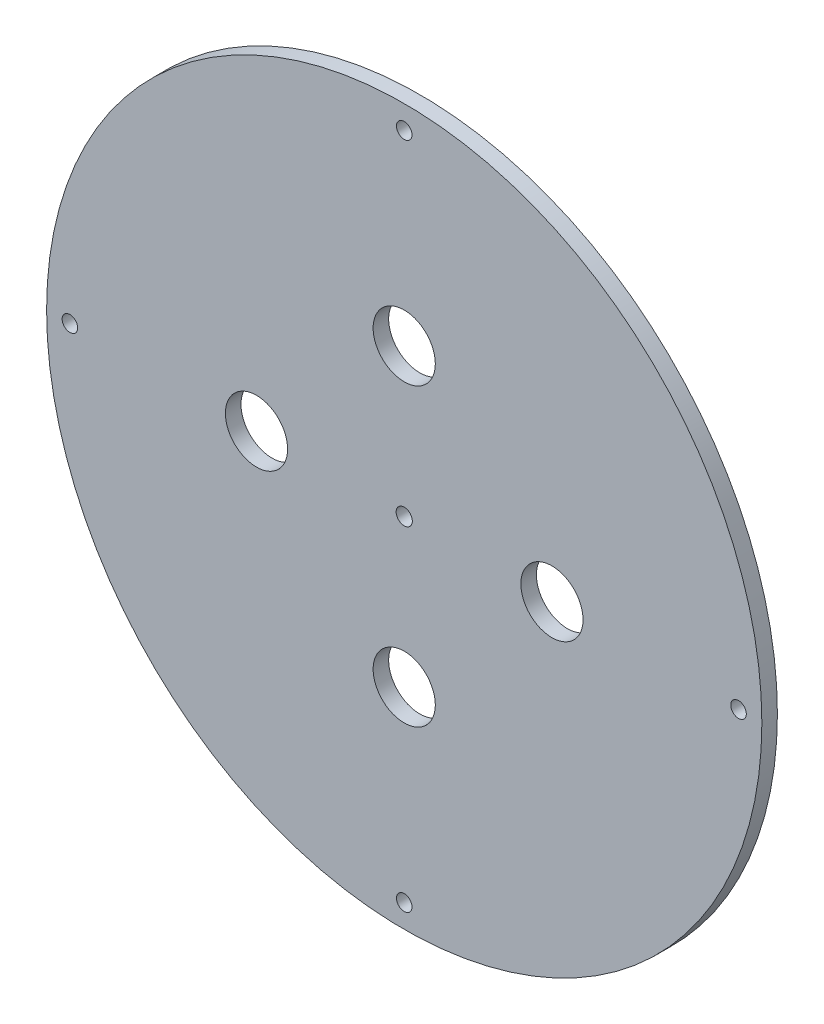
ISO-10303-21;
HEADER;
FILE_DESCRIPTION(('STEP AP214'),'2;1');
FILE_NAME('part.step','',(''),(''),'','','');
FILE_SCHEMA(('AUTOMOTIVE_DESIGN { 1 0 10303 214 1 1 1 1 }'));
ENDSEC;
DATA;
#1=APPLICATION_CONTEXT('core data for automotive mechanical design processes');
#2=APPLICATION_PROTOCOL_DEFINITION('international standard','automotive_design',2000,#1);
#3=PRODUCT_CONTEXT('',#1,'mechanical');
#4=PRODUCT('Part','Part','',(#3));
#5=PRODUCT_RELATED_PRODUCT_CATEGORY('part','',(#4));
#6=PRODUCT_DEFINITION_FORMATION('','',#4);
#7=PRODUCT_DEFINITION_CONTEXT('part definition',#1,'design');
#8=PRODUCT_DEFINITION('design','',#6,#7);
#9=PRODUCT_DEFINITION_SHAPE('','',#8);
#10=(LENGTH_UNIT() NAMED_UNIT(*) SI_UNIT(.MILLI.,.METRE.));
#11=(NAMED_UNIT(*) PLANE_ANGLE_UNIT() SI_UNIT($,.RADIAN.));
#12=(NAMED_UNIT(*) SI_UNIT($,.STERADIAN.) SOLID_ANGLE_UNIT());
#13=UNCERTAINTY_MEASURE_WITH_UNIT(LENGTH_MEASURE(1.E-05),#10,'distance_accuracy_value','');
#14=(GEOMETRIC_REPRESENTATION_CONTEXT(3) GLOBAL_UNCERTAINTY_ASSIGNED_CONTEXT((#13)) GLOBAL_UNIT_ASSIGNED_CONTEXT((#10,
#11,#12)) REPRESENTATION_CONTEXT('',''));
#15=CARTESIAN_POINT('',(0.,0.,0.));
#16=DIRECTION('',(0.,0.,1.));
#17=DIRECTION('',(1.,0.,0.));
#18=AXIS2_PLACEMENT_3D('',#15,#16,#17);
#19=CARTESIAN_POINT('',(0.,0.,6.35));
#20=DIRECTION('',(0.,0.,1.));
#21=DIRECTION('',(1.,0.,0.));
#22=AXIS2_PLACEMENT_3D('',#19,#20,#21);
#23=PLANE('',#22);
#24=CARTESIAN_POINT('',(3.41430387914653E-12,-60.325,6.35));
#25=DIRECTION('',(0.,0.,1.));
#26=DIRECTION('',(1.,0.,0.));
#27=AXIS2_PLACEMENT_3D('',#24,#25,#26);
#28=CIRCLE('',#27,12.7000000000037);
#29=CARTESIAN_POINT('',(12.7000000000071,-60.325,6.35));
#30=VERTEX_POINT('',#29);
#31=EDGE_CURVE('E90',#30,#30,#28,.T.);
#32=ORIENTED_EDGE('',*,*,#31,.F.);
#33=EDGE_LOOP('',(#32));
#34=FACE_BOUND('',#33,.T.);
#35=CARTESIAN_POINT('',(0.,0.,6.35));
#36=DIRECTION('',(0.,0.,1.));
#37=DIRECTION('',(1.,0.,0.));
#38=AXIS2_PLACEMENT_3D('',#35,#36,#37);
#39=CIRCLE('',#38,3.302);
#40=CARTESIAN_POINT('',(3.302,0.,6.35));
#41=VERTEX_POINT('',#40);
#42=EDGE_CURVE('E76',#41,#41,#39,.T.);
#43=ORIENTED_EDGE('',*,*,#42,.F.);
#44=EDGE_LOOP('',(#43));
#45=FACE_BOUND('',#44,.T.);
#46=CARTESIAN_POINT('',(2.4651822361902E-12,-136.525,6.35));
#47=DIRECTION('',(0.,0.,1.));
#48=DIRECTION('',(1.,0.,0.));
#49=AXIS2_PLACEMENT_3D('',#46,#47,#48);
#50=CIRCLE('',#49,3.175);
#51=CARTESIAN_POINT('',(3.17500000000246,-136.525,6.35));
#52=VERTEX_POINT('',#51);
#53=EDGE_CURVE('E62',#52,#52,#50,.T.);
#54=ORIENTED_EDGE('',*,*,#53,.F.);
#55=EDGE_LOOP('',(#54));
#56=FACE_BOUND('',#55,.T.);
#57=CARTESIAN_POINT('',(0.,60.325,6.35));
#58=DIRECTION('',(0.,0.,1.));
#59=DIRECTION('',(1.,0.,0.));
#60=AXIS2_PLACEMENT_3D('',#57,#58,#59);
#61=CIRCLE('',#60,12.7);
#62=CARTESIAN_POINT('',(12.7,60.325,6.35));
#63=VERTEX_POINT('',#62);
#64=EDGE_CURVE('E52',#63,#63,#61,.T.);
#65=ORIENTED_EDGE('',*,*,#64,.F.);
#66=EDGE_LOOP('',(#65));
#67=FACE_BOUND('',#66,.T.);
#68=CARTESIAN_POINT('',(0.,0.,6.35));
#69=DIRECTION('',(0.,0.,1.));
#70=DIRECTION('',(1.,0.,0.));
#71=AXIS2_PLACEMENT_3D('',#68,#69,#70);
#72=CIRCLE('',#71,146.05);
#73=CARTESIAN_POINT('',(146.05,0.,6.35));
#74=VERTEX_POINT('',#73);
#75=EDGE_CURVE('E10',#74,#74,#72,.T.);
#76=ORIENTED_EDGE('',*,*,#75,.T.);
#77=EDGE_LOOP('',(#76));
#78=FACE_BOUND('',#77,.T.);
#79=CARTESIAN_POINT('',(0.,136.525,6.35));
#80=DIRECTION('',(0.,0.,1.));
#81=DIRECTION('',(1.,0.,0.));
#82=AXIS2_PLACEMENT_3D('',#79,#80,#81);
#83=CIRCLE('',#82,3.175);
#84=CARTESIAN_POINT('',(3.175,136.525,6.35));
#85=VERTEX_POINT('',#84);
#86=EDGE_CURVE('E48',#85,#85,#83,.T.);
#87=ORIENTED_EDGE('',*,*,#86,.F.);
#88=EDGE_LOOP('',(#87));
#89=FACE_BOUND('',#88,.T.);
#90=CARTESIAN_POINT('',(136.525000000001,1.2325911180951E-12,6.35));
#91=DIRECTION('',(0.,0.,1.));
#92=DIRECTION('',(1.,0.,0.));
#93=AXIS2_PLACEMENT_3D('',#90,#91,#92);
#94=CIRCLE('',#93,3.175);
#95=CARTESIAN_POINT('',(139.700000000001,1.2325911180951E-12,6.35));
#96=VERTEX_POINT('',#95);
#97=EDGE_CURVE('E56',#96,#96,#94,.T.);
#98=ORIENTED_EDGE('',*,*,#97,.F.);
#99=EDGE_LOOP('',(#98));
#100=FACE_BOUND('',#99,.T.);
#101=CARTESIAN_POINT('',(-136.524999999999,-1.24931060852046E-12,6.35));
#102=DIRECTION('',(0.,0.,1.));
#103=DIRECTION('',(1.,0.,0.));
#104=AXIS2_PLACEMENT_3D('',#101,#102,#103);
#105=CIRCLE('',#104,3.175);
#106=CARTESIAN_POINT('',(-133.349999999999,-1.24931060852046E-12,6.35));
#107=VERTEX_POINT('',#106);
#108=EDGE_CURVE('E72',#107,#107,#105,.T.);
#109=ORIENTED_EDGE('',*,*,#108,.F.);
#110=EDGE_LOOP('',(#109));
#111=FACE_BOUND('',#110,.T.);
#112=CARTESIAN_POINT('',(60.3250000000017,1.70715193957327E-12,6.35));
#113=DIRECTION('',(0.,0.,1.));
#114=DIRECTION('',(1.,0.,0.));
#115=AXIS2_PLACEMENT_3D('',#112,#113,#114);
#116=CIRCLE('',#115,12.7000000000013);
#117=CARTESIAN_POINT('',(73.025000000003,1.70715193957327E-12,6.35));
#118=VERTEX_POINT('',#117);
#119=EDGE_CURVE('E83',#118,#118,#116,.T.);
#120=ORIENTED_EDGE('',*,*,#119,.F.);
#121=EDGE_LOOP('',(#120));
#122=FACE_BOUND('',#121,.T.);
#123=CARTESIAN_POINT('',(-60.3249999999983,-1.71453962138912E-12,6.35));
#124=DIRECTION('',(0.,0.,1.));
#125=DIRECTION('',(1.,0.,0.));
#126=AXIS2_PLACEMENT_3D('',#123,#124,#125);
#127=CIRCLE('',#126,12.7000000000027);
#128=CARTESIAN_POINT('',(-47.6249999999956,-1.71453962138912E-12,6.35));
#129=VERTEX_POINT('',#128);
#130=EDGE_CURVE('E92',#129,#129,#127,.T.);
#131=ORIENTED_EDGE('',*,*,#130,.F.);
#132=EDGE_LOOP('',(#131));
#133=FACE_BOUND('',#132,.T.);
#134=ADVANCED_FACE('F40',(#34,#45,#56,#67,#78,#89,#100,#111,#122,#133),#23,.T.);
#135=CARTESIAN_POINT('',(0.,0.,0.));
#136=DIRECTION('',(0.,0.,1.));
#137=DIRECTION('',(1.,0.,0.));
#138=AXIS2_PLACEMENT_3D('',#135,#136,#137);
#139=PLANE('',#138);
#140=CARTESIAN_POINT('',(0.,0.,0.));
#141=DIRECTION('',(0.,0.,1.));
#142=DIRECTION('',(1.,0.,0.));
#143=AXIS2_PLACEMENT_3D('',#140,#141,#142);
#144=CIRCLE('',#143,146.05);
#145=CARTESIAN_POINT('',(146.05,0.,0.));
#146=VERTEX_POINT('',#145);
#147=EDGE_CURVE('E41',#146,#146,#144,.T.);
#148=ORIENTED_EDGE('',*,*,#147,.F.);
#149=EDGE_LOOP('',(#148));
#150=FACE_BOUND('',#149,.T.);
#151=CARTESIAN_POINT('',(0.,136.525,0.));
#152=DIRECTION('',(0.,0.,1.));
#153=DIRECTION('',(1.,0.,0.));
#154=AXIS2_PLACEMENT_3D('',#151,#152,#153);
#155=CIRCLE('',#154,3.175);
#156=CARTESIAN_POINT('',(3.175,136.525,0.));
#157=VERTEX_POINT('',#156);
#158=EDGE_CURVE('E49',#157,#157,#155,.T.);
#159=ORIENTED_EDGE('',*,*,#158,.T.);
#160=EDGE_LOOP('',(#159));
#161=FACE_BOUND('',#160,.T.);
#162=CARTESIAN_POINT('',(0.,60.325,0.));
#163=DIRECTION('',(0.,0.,1.));
#164=DIRECTION('',(1.,0.,0.));
#165=AXIS2_PLACEMENT_3D('',#162,#163,#164);
#166=CIRCLE('',#165,12.7);
#167=CARTESIAN_POINT('',(12.7,60.325,0.));
#168=VERTEX_POINT('',#167);
#169=EDGE_CURVE('E57',#168,#168,#166,.T.);
#170=ORIENTED_EDGE('',*,*,#169,.T.);
#171=EDGE_LOOP('',(#170));
#172=FACE_BOUND('',#171,.T.);
#173=CARTESIAN_POINT('',(136.525000000001,1.2325911180951E-12,0.));
#174=DIRECTION('',(0.,0.,1.));
#175=DIRECTION('',(1.,0.,0.));
#176=AXIS2_PLACEMENT_3D('',#173,#174,#175);
#177=CIRCLE('',#176,3.175);
#178=CARTESIAN_POINT('',(139.700000000001,1.2325911180951E-12,0.));
#179=VERTEX_POINT('',#178);
#180=EDGE_CURVE('E61',#179,#179,#177,.T.);
#181=ORIENTED_EDGE('',*,*,#180,.T.);
#182=EDGE_LOOP('',(#181));
#183=FACE_BOUND('',#182,.T.);
#184=CARTESIAN_POINT('',(2.4651822361902E-12,-136.525,0.));
#185=DIRECTION('',(0.,0.,1.));
#186=DIRECTION('',(1.,0.,0.));
#187=AXIS2_PLACEMENT_3D('',#184,#185,#186);
#188=CIRCLE('',#187,3.175);
#189=CARTESIAN_POINT('',(3.17500000000246,-136.525,0.));
#190=VERTEX_POINT('',#189);
#191=EDGE_CURVE('E68',#190,#190,#188,.T.);
#192=ORIENTED_EDGE('',*,*,#191,.T.);
#193=EDGE_LOOP('',(#192));
#194=FACE_BOUND('',#193,.T.);
#195=CARTESIAN_POINT('',(-136.524999999999,-1.24931060852046E-12,0.));
#196=DIRECTION('',(0.,0.,1.));
#197=DIRECTION('',(1.,0.,0.));
#198=AXIS2_PLACEMENT_3D('',#195,#196,#197);
#199=CIRCLE('',#198,3.175);
#200=CARTESIAN_POINT('',(-133.349999999999,-1.24931060852046E-12,0.));
#201=VERTEX_POINT('',#200);
#202=EDGE_CURVE('E74',#201,#201,#199,.T.);
#203=ORIENTED_EDGE('',*,*,#202,.T.);
#204=EDGE_LOOP('',(#203));
#205=FACE_BOUND('',#204,.T.);
#206=CARTESIAN_POINT('',(0.,0.,0.));
#207=DIRECTION('',(0.,0.,1.));
#208=DIRECTION('',(1.,0.,0.));
#209=AXIS2_PLACEMENT_3D('',#206,#207,#208);
#210=CIRCLE('',#209,3.302);
#211=CARTESIAN_POINT('',(3.302,0.,0.));
#212=VERTEX_POINT('',#211);
#213=EDGE_CURVE('E77',#212,#212,#210,.T.);
#214=ORIENTED_EDGE('',*,*,#213,.T.);
#215=EDGE_LOOP('',(#214));
#216=FACE_BOUND('',#215,.T.);
#217=CARTESIAN_POINT('',(60.3250000000017,1.70715193957327E-12,0.));
#218=DIRECTION('',(0.,0.,1.));
#219=DIRECTION('',(1.,0.,0.));
#220=AXIS2_PLACEMENT_3D('',#217,#218,#219);
#221=CIRCLE('',#220,12.7000000000013);
#222=CARTESIAN_POINT('',(73.025000000003,1.70715193957327E-12,0.));
#223=VERTEX_POINT('',#222);
#224=EDGE_CURVE('E88',#223,#223,#221,.T.);
#225=ORIENTED_EDGE('',*,*,#224,.T.);
#226=EDGE_LOOP('',(#225));
#227=FACE_BOUND('',#226,.T.);
#228=CARTESIAN_POINT('',(3.41430387914653E-12,-60.325,0.));
#229=DIRECTION('',(0.,0.,1.));
#230=DIRECTION('',(1.,0.,0.));
#231=AXIS2_PLACEMENT_3D('',#228,#229,#230);
#232=CIRCLE('',#231,12.7000000000037);
#233=CARTESIAN_POINT('',(12.7000000000071,-60.325,0.));
#234=VERTEX_POINT('',#233);
#235=EDGE_CURVE('E95',#234,#234,#232,.T.);
#236=ORIENTED_EDGE('',*,*,#235,.T.);
#237=EDGE_LOOP('',(#236));
#238=FACE_BOUND('',#237,.T.);
#239=CARTESIAN_POINT('',(-60.3249999999983,-1.71453962138912E-12,0.));
#240=DIRECTION('',(0.,0.,1.));
#241=DIRECTION('',(1.,0.,0.));
#242=AXIS2_PLACEMENT_3D('',#239,#240,#241);
#243=CIRCLE('',#242,12.7000000000027);
#244=CARTESIAN_POINT('',(-47.6249999999956,-1.71453962138912E-12,0.));
#245=VERTEX_POINT('',#244);
#246=EDGE_CURVE('E98',#245,#245,#243,.T.);
#247=ORIENTED_EDGE('',*,*,#246,.T.);
#248=EDGE_LOOP('',(#247));
#249=FACE_BOUND('',#248,.T.);
#250=ADVANCED_FACE('F107',(#150,#161,#172,#183,#194,#205,#216,#227,#238,#249),#139,.F.);
#251=CARTESIAN_POINT('',(0.,0.,6.35));
#252=DIRECTION('',(0.,0.,-1.));
#253=DIRECTION('',(-1.,0.,0.));
#254=AXIS2_PLACEMENT_3D('',#251,#252,#253);
#255=CYLINDRICAL_SURFACE('',#254,146.05);
#256=ORIENTED_EDGE('',*,*,#75,.F.);
#257=EDGE_LOOP('',(#256));
#258=FACE_BOUND('',#257,.T.);
#259=ORIENTED_EDGE('',*,*,#147,.T.);
#260=EDGE_LOOP('',(#259));
#261=FACE_BOUND('',#260,.T.);
#262=ADVANCED_FACE('F39',(#258,#261),#255,.T.);
#263=CARTESIAN_POINT('',(0.,136.525,6.35));
#264=DIRECTION('',(0.,0.,-1.));
#265=DIRECTION('',(-1.,0.,0.));
#266=AXIS2_PLACEMENT_3D('',#263,#264,#265);
#267=CYLINDRICAL_SURFACE('',#266,3.175);
#268=ORIENTED_EDGE('',*,*,#86,.T.);
#269=EDGE_LOOP('',(#268));
#270=FACE_BOUND('',#269,.T.);
#271=ORIENTED_EDGE('',*,*,#158,.F.);
#272=EDGE_LOOP('',(#271));
#273=FACE_BOUND('',#272,.T.);
#274=ADVANCED_FACE('F120',(#270,#273),#267,.F.);
#275=CARTESIAN_POINT('',(0.,60.325,6.35));
#276=DIRECTION('',(0.,0.,-1.));
#277=DIRECTION('',(-1.,0.,0.));
#278=AXIS2_PLACEMENT_3D('',#275,#276,#277);
#279=CYLINDRICAL_SURFACE('',#278,12.7);
#280=ORIENTED_EDGE('',*,*,#64,.T.);
#281=EDGE_LOOP('',(#280));
#282=FACE_BOUND('',#281,.T.);
#283=ORIENTED_EDGE('',*,*,#169,.F.);
#284=EDGE_LOOP('',(#283));
#285=FACE_BOUND('',#284,.T.);
#286=ADVANCED_FACE('F121',(#282,#285),#279,.F.);
#287=CARTESIAN_POINT('',(136.525000000001,1.2325911180951E-12,6.35));
#288=DIRECTION('',(0.,0.,-1.));
#289=DIRECTION('',(-1.,0.,0.));
#290=AXIS2_PLACEMENT_3D('',#287,#288,#289);
#291=CYLINDRICAL_SURFACE('',#290,3.175);
#292=ORIENTED_EDGE('',*,*,#97,.T.);
#293=EDGE_LOOP('',(#292));
#294=FACE_BOUND('',#293,.T.);
#295=ORIENTED_EDGE('',*,*,#180,.F.);
#296=EDGE_LOOP('',(#295));
#297=FACE_BOUND('',#296,.T.);
#298=ADVANCED_FACE('F124',(#294,#297),#291,.F.);
#299=CARTESIAN_POINT('',(2.4651822361902E-12,-136.525,6.35));
#300=DIRECTION('',(0.,0.,-1.));
#301=DIRECTION('',(-1.,0.,0.));
#302=AXIS2_PLACEMENT_3D('',#299,#300,#301);
#303=CYLINDRICAL_SURFACE('',#302,3.175);
#304=ORIENTED_EDGE('',*,*,#53,.T.);
#305=EDGE_LOOP('',(#304));
#306=FACE_BOUND('',#305,.T.);
#307=ORIENTED_EDGE('',*,*,#191,.F.);
#308=EDGE_LOOP('',(#307));
#309=FACE_BOUND('',#308,.T.);
#310=ADVANCED_FACE('F129',(#306,#309),#303,.F.);
#311=CARTESIAN_POINT('',(-136.524999999999,-1.24931060852046E-12,6.35));
#312=DIRECTION('',(0.,0.,-1.));
#313=DIRECTION('',(-1.,0.,0.));
#314=AXIS2_PLACEMENT_3D('',#311,#312,#313);
#315=CYLINDRICAL_SURFACE('',#314,3.175);
#316=ORIENTED_EDGE('',*,*,#108,.T.);
#317=EDGE_LOOP('',(#316));
#318=FACE_BOUND('',#317,.T.);
#319=ORIENTED_EDGE('',*,*,#202,.F.);
#320=EDGE_LOOP('',(#319));
#321=FACE_BOUND('',#320,.T.);
#322=ADVANCED_FACE('F135',(#318,#321),#315,.F.);
#323=CARTESIAN_POINT('',(0.,0.,6.35));
#324=DIRECTION('',(0.,0.,-1.));
#325=DIRECTION('',(-1.,0.,0.));
#326=AXIS2_PLACEMENT_3D('',#323,#324,#325);
#327=CYLINDRICAL_SURFACE('',#326,3.302);
#328=ORIENTED_EDGE('',*,*,#42,.T.);
#329=EDGE_LOOP('',(#328));
#330=FACE_BOUND('',#329,.T.);
#331=ORIENTED_EDGE('',*,*,#213,.F.);
#332=EDGE_LOOP('',(#331));
#333=FACE_BOUND('',#332,.T.);
#334=ADVANCED_FACE('F140',(#330,#333),#327,.F.);
#335=CARTESIAN_POINT('',(60.3250000000017,1.70715193957327E-12,6.35));
#336=DIRECTION('',(0.,0.,-1.));
#337=DIRECTION('',(-1.,0.,0.));
#338=AXIS2_PLACEMENT_3D('',#335,#336,#337);
#339=CYLINDRICAL_SURFACE('',#338,12.7000000000013);
#340=ORIENTED_EDGE('',*,*,#119,.T.);
#341=EDGE_LOOP('',(#340));
#342=FACE_BOUND('',#341,.T.);
#343=ORIENTED_EDGE('',*,*,#224,.F.);
#344=EDGE_LOOP('',(#343));
#345=FACE_BOUND('',#344,.T.);
#346=ADVANCED_FACE('F143',(#342,#345),#339,.F.);
#347=CARTESIAN_POINT('',(3.41430387914653E-12,-60.325,6.35));
#348=DIRECTION('',(0.,0.,-1.));
#349=DIRECTION('',(-1.,0.,0.));
#350=AXIS2_PLACEMENT_3D('',#347,#348,#349);
#351=CYLINDRICAL_SURFACE('',#350,12.7000000000037);
#352=ORIENTED_EDGE('',*,*,#31,.T.);
#353=EDGE_LOOP('',(#352));
#354=FACE_BOUND('',#353,.T.);
#355=ORIENTED_EDGE('',*,*,#235,.F.);
#356=EDGE_LOOP('',(#355));
#357=FACE_BOUND('',#356,.T.);
#358=ADVANCED_FACE('F144',(#354,#357),#351,.F.);
#359=CARTESIAN_POINT('',(-60.3249999999983,-1.71453962138912E-12,6.35));
#360=DIRECTION('',(0.,0.,-1.));
#361=DIRECTION('',(-1.,0.,0.));
#362=AXIS2_PLACEMENT_3D('',#359,#360,#361);
#363=CYLINDRICAL_SURFACE('',#362,12.7000000000027);
#364=ORIENTED_EDGE('',*,*,#130,.T.);
#365=EDGE_LOOP('',(#364));
#366=FACE_BOUND('',#365,.T.);
#367=ORIENTED_EDGE('',*,*,#246,.F.);
#368=EDGE_LOOP('',(#367));
#369=FACE_BOUND('',#368,.T.);
#370=ADVANCED_FACE('F102',(#366,#369),#363,.F.);
#371=CLOSED_SHELL('',(#134,#250,#262,#274,#286,#298,#310,#322,#334,#346,#358,#370));
#372=MANIFOLD_SOLID_BREP('B2',#371);
#373=ADVANCED_BREP_SHAPE_REPRESENTATION('',(#18,#372),#14);
#374=SHAPE_DEFINITION_REPRESENTATION(#9,#373);
ENDSEC;
END-ISO-10303-21;
